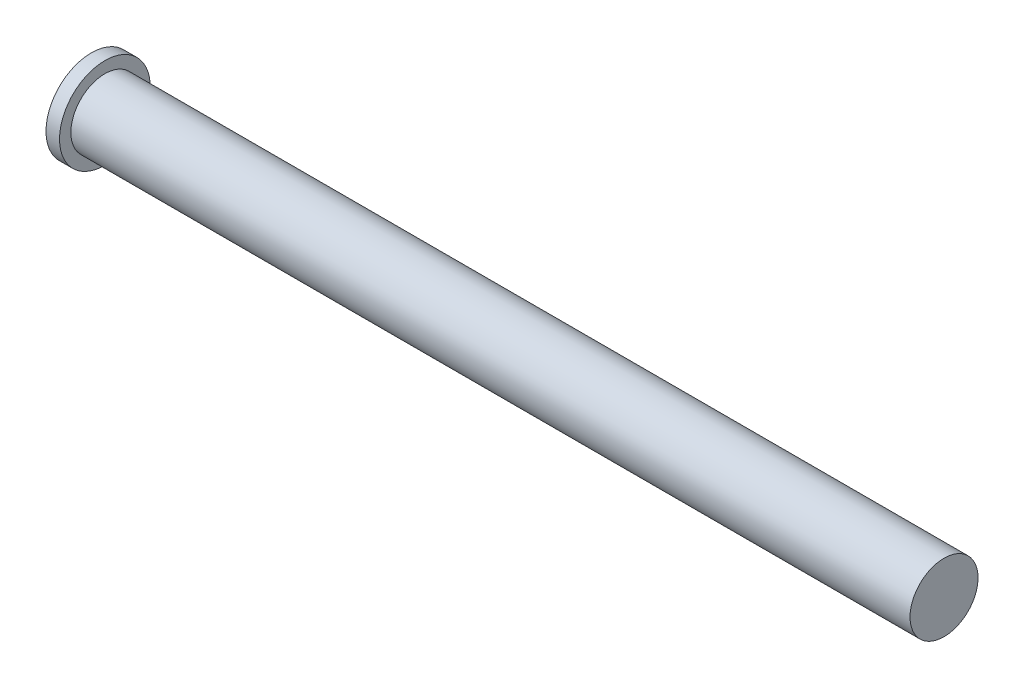
ISO-10303-21;
HEADER;
FILE_DESCRIPTION(('STEP AP214'),'2;1');
FILE_NAME('part.step','',(''),(''),'','','');
FILE_SCHEMA(('AUTOMOTIVE_DESIGN { 1 0 10303 214 1 1 1 1 }'));
ENDSEC;
DATA;
#1=APPLICATION_CONTEXT('core data for automotive mechanical design processes');
#2=APPLICATION_PROTOCOL_DEFINITION('international standard','automotive_design',2000,#1);
#3=PRODUCT_CONTEXT('',#1,'mechanical');
#4=PRODUCT('Part','Part','',(#3));
#5=PRODUCT_RELATED_PRODUCT_CATEGORY('part','',(#4));
#6=PRODUCT_DEFINITION_FORMATION('','',#4);
#7=PRODUCT_DEFINITION_CONTEXT('part definition',#1,'design');
#8=PRODUCT_DEFINITION('design','',#6,#7);
#9=PRODUCT_DEFINITION_SHAPE('','',#8);
#10=(LENGTH_UNIT() NAMED_UNIT(*) SI_UNIT(.MILLI.,.METRE.));
#11=(NAMED_UNIT(*) PLANE_ANGLE_UNIT() SI_UNIT($,.RADIAN.));
#12=(NAMED_UNIT(*) SI_UNIT($,.STERADIAN.) SOLID_ANGLE_UNIT());
#13=UNCERTAINTY_MEASURE_WITH_UNIT(LENGTH_MEASURE(1.E-05),#10,'distance_accuracy_value','');
#14=(GEOMETRIC_REPRESENTATION_CONTEXT(3) GLOBAL_UNCERTAINTY_ASSIGNED_CONTEXT((#13)) GLOBAL_UNIT_ASSIGNED_CONTEXT((#10,
#11,#12)) REPRESENTATION_CONTEXT('',''));
#15=CARTESIAN_POINT('',(0.,0.,0.));
#16=DIRECTION('',(0.,0.,1.));
#17=DIRECTION('',(1.,0.,0.));
#18=AXIS2_PLACEMENT_3D('',#15,#16,#17);
#19=CARTESIAN_POINT('',(1.5,0.,0.866025403784439));
#20=DIRECTION('',(-1.,0.,0.));
#21=DIRECTION('',(0.,0.,1.));
#22=AXIS2_PLACEMENT_3D('',#19,#20,#21);
#23=PLANE('',#22);
#24=DIRECTION('',(0.,0.,1.));
#25=VECTOR('',#24,1.);
#26=CARTESIAN_POINT('',(1.5,-0.75,-0.433012701892219));
#27=LINE('',#26,#25);
#28=CARTESIAN_POINT('',(1.5,-0.75,0.43301270189222));
#29=VERTEX_POINT('',#28);
#30=CARTESIAN_POINT('',(1.5,-0.75,-0.433012701892219));
#31=VERTEX_POINT('',#30);
#32=EDGE_CURVE('E130',#29,#31,#27,.F.);
#33=ORIENTED_EDGE('',*,*,#32,.F.);
#34=DIRECTION('',(0.,0.866025403784439,0.5));
#35=VECTOR('',#34,1.);
#36=CARTESIAN_POINT('',(1.5,-0.75,0.43301270189222));
#37=LINE('',#36,#35);
#38=CARTESIAN_POINT('',(1.5,0.,0.866025403784439));
#39=VERTEX_POINT('',#38);
#40=EDGE_CURVE('E124',#39,#29,#37,.F.);
#41=ORIENTED_EDGE('',*,*,#40,.F.);
#42=DIRECTION('',(0.,0.866025403784439,-0.5));
#43=VECTOR('',#42,1.);
#44=CARTESIAN_POINT('',(1.5,0.75,0.433012701892219));
#45=LINE('',#44,#43);
#46=CARTESIAN_POINT('',(1.5,0.75,0.433012701892219));
#47=VERTEX_POINT('',#46);
#48=EDGE_CURVE('E74',#47,#39,#45,.F.);
#49=ORIENTED_EDGE('',*,*,#48,.F.);
#50=DIRECTION('',(0.,0.,-1.));
#51=VECTOR('',#50,1.);
#52=CARTESIAN_POINT('',(1.5,0.75,0.433012701892219));
#53=LINE('',#52,#51);
#54=CARTESIAN_POINT('',(1.5,0.75,-0.43301270189222));
#55=VERTEX_POINT('',#54);
#56=EDGE_CURVE('E71',#55,#47,#53,.F.);
#57=ORIENTED_EDGE('',*,*,#56,.F.);
#58=DIRECTION('',(0.,-0.866025403784439,-0.5));
#59=VECTOR('',#58,1.);
#60=CARTESIAN_POINT('',(1.5,0.75,-0.43301270189222));
#61=LINE('',#60,#59);
#62=CARTESIAN_POINT('',(1.5,0.,-0.866025403784439));
#63=VERTEX_POINT('',#62);
#64=EDGE_CURVE('E68',#63,#55,#61,.F.);
#65=ORIENTED_EDGE('',*,*,#64,.F.);
#66=DIRECTION('',(0.,-0.866025403784439,0.5));
#67=VECTOR('',#66,1.);
#68=CARTESIAN_POINT('',(1.5,0.,-0.866025403784439));
#69=LINE('',#68,#67);
#70=EDGE_CURVE('E85',#31,#63,#69,.F.);
#71=ORIENTED_EDGE('',*,*,#70,.F.);
#72=EDGE_LOOP('',(#33,#41,#49,#57,#65,#71));
#73=FACE_BOUND('',#72,.T.);
#74=ADVANCED_FACE('F17',(#73),#23,.T.);
#75=CARTESIAN_POINT('',(1.5,0.75,0.433012701892219));
#76=DIRECTION('',(0.,-1.,0.));
#77=DIRECTION('',(0.,0.,-1.));
#78=AXIS2_PLACEMENT_3D('',#75,#76,#77);
#79=PLANE('',#78);
#80=ORIENTED_EDGE('',*,*,#56,.T.);
#81=DIRECTION('',(1.,0.,0.));
#82=VECTOR('',#81,1.);
#83=CARTESIAN_POINT('',(1.5,0.75,0.433012701892219));
#84=LINE('',#83,#82);
#85=CARTESIAN_POINT('',(0.,0.75,0.433012701892219));
#86=VERTEX_POINT('',#85);
#87=EDGE_CURVE('E120',#86,#47,#84,.T.);
#88=ORIENTED_EDGE('',*,*,#87,.F.);
#89=DIRECTION('',(0.,0.,-1.));
#90=VECTOR('',#89,1.);
#91=CARTESIAN_POINT('',(0.,0.75,0.));
#92=LINE('',#91,#90);
#93=CARTESIAN_POINT('',(0.,0.75,-0.43301270189222));
#94=VERTEX_POINT('',#93);
#95=EDGE_CURVE('E82',#86,#94,#92,.T.);
#96=ORIENTED_EDGE('',*,*,#95,.T.);
#97=DIRECTION('',(1.,0.,0.));
#98=VECTOR('',#97,1.);
#99=CARTESIAN_POINT('',(1.5,0.75,-0.43301270189222));
#100=LINE('',#99,#98);
#101=EDGE_CURVE('E79',#55,#94,#100,.F.);
#102=ORIENTED_EDGE('',*,*,#101,.F.);
#103=EDGE_LOOP('',(#80,#88,#96,#102));
#104=FACE_BOUND('',#103,.T.);
#105=ADVANCED_FACE('F80',(#104),#79,.T.);
#106=CARTESIAN_POINT('',(1.5,0.75,-0.43301270189222));
#107=DIRECTION('',(0.,-0.5,0.866025403784439));
#108=DIRECTION('',(0.,-0.866025403784439,-0.5));
#109=AXIS2_PLACEMENT_3D('',#106,#107,#108);
#110=PLANE('',#109);
#111=ORIENTED_EDGE('',*,*,#64,.T.);
#112=ORIENTED_EDGE('',*,*,#101,.T.);
#113=DIRECTION('',(0.,-0.866025403784439,-0.5));
#114=VECTOR('',#113,1.);
#115=CARTESIAN_POINT('',(0.,0.75,-0.43301270189222));
#116=LINE('',#115,#114);
#117=CARTESIAN_POINT('',(0.,0.,-0.866025403784439));
#118=VERTEX_POINT('',#117);
#119=EDGE_CURVE('E114',#94,#118,#116,.T.);
#120=ORIENTED_EDGE('',*,*,#119,.T.);
#121=DIRECTION('',(1.,0.,0.));
#122=VECTOR('',#121,1.);
#123=CARTESIAN_POINT('',(1.5,0.,-0.866025403784439));
#124=LINE('',#123,#122);
#125=EDGE_CURVE('E89',#63,#118,#124,.F.);
#126=ORIENTED_EDGE('',*,*,#125,.F.);
#127=EDGE_LOOP('',(#111,#112,#120,#126));
#128=FACE_BOUND('',#127,.T.);
#129=ADVANCED_FACE('F87',(#128),#110,.T.);
#130=CARTESIAN_POINT('',(1.5,0.,-0.866025403784439));
#131=DIRECTION('',(0.,0.5,0.866025403784439));
#132=DIRECTION('',(0.,-0.866025403784439,0.5));
#133=AXIS2_PLACEMENT_3D('',#130,#131,#132);
#134=PLANE('',#133);
#135=ORIENTED_EDGE('',*,*,#70,.T.);
#136=ORIENTED_EDGE('',*,*,#125,.T.);
#137=DIRECTION('',(0.,-0.866025403784439,0.5));
#138=VECTOR('',#137,1.);
#139=CARTESIAN_POINT('',(0.,0.,-0.866025403784439));
#140=LINE('',#139,#138);
#141=CARTESIAN_POINT('',(0.,-0.75,-0.433012701892219));
#142=VERTEX_POINT('',#141);
#143=EDGE_CURVE('E112',#118,#142,#140,.T.);
#144=ORIENTED_EDGE('',*,*,#143,.T.);
#145=DIRECTION('',(1.,0.,0.));
#146=VECTOR('',#145,1.);
#147=CARTESIAN_POINT('',(1.5,-0.75,-0.433012701892219));
#148=LINE('',#147,#146);
#149=EDGE_CURVE('E127',#31,#142,#148,.F.);
#150=ORIENTED_EDGE('',*,*,#149,.F.);
#151=EDGE_LOOP('',(#135,#136,#144,#150));
#152=FACE_BOUND('',#151,.T.);
#153=ADVANCED_FACE('F135',(#152),#134,.T.);
#154=CARTESIAN_POINT('',(1.5,-0.75,-0.433012701892219));
#155=DIRECTION('',(0.,1.,0.));
#156=DIRECTION('',(0.,0.,1.));
#157=AXIS2_PLACEMENT_3D('',#154,#155,#156);
#158=PLANE('',#157);
#159=ORIENTED_EDGE('',*,*,#32,.T.);
#160=ORIENTED_EDGE('',*,*,#149,.T.);
#161=DIRECTION('',(0.,0.,-1.));
#162=VECTOR('',#161,1.);
#163=CARTESIAN_POINT('',(0.,-0.75,0.));
#164=LINE('',#163,#162);
#165=CARTESIAN_POINT('',(0.,-0.75,0.43301270189222));
#166=VERTEX_POINT('',#165);
#167=EDGE_CURVE('E110',#142,#166,#164,.F.);
#168=ORIENTED_EDGE('',*,*,#167,.T.);
#169=DIRECTION('',(1.,0.,0.));
#170=VECTOR('',#169,1.);
#171=CARTESIAN_POINT('',(1.5,-0.75,0.43301270189222));
#172=LINE('',#171,#170);
#173=EDGE_CURVE('E122',#29,#166,#172,.F.);
#174=ORIENTED_EDGE('',*,*,#173,.F.);
#175=EDGE_LOOP('',(#159,#160,#168,#174));
#176=FACE_BOUND('',#175,.T.);
#177=ADVANCED_FACE('F139',(#176),#158,.T.);
#178=CARTESIAN_POINT('',(1.5,-0.75,0.43301270189222));
#179=DIRECTION('',(0.,0.5,-0.866025403784439));
#180=DIRECTION('',(0.,0.866025403784439,0.5));
#181=AXIS2_PLACEMENT_3D('',#178,#179,#180);
#182=PLANE('',#181);
#183=ORIENTED_EDGE('',*,*,#40,.T.);
#184=ORIENTED_EDGE('',*,*,#173,.T.);
#185=DIRECTION('',(0.,0.866025403784439,0.5));
#186=VECTOR('',#185,1.);
#187=CARTESIAN_POINT('',(0.,-0.75,0.43301270189222));
#188=LINE('',#187,#186);
#189=CARTESIAN_POINT('',(0.,0.,0.866025403784439));
#190=VERTEX_POINT('',#189);
#191=EDGE_CURVE('E35',#166,#190,#188,.T.);
#192=ORIENTED_EDGE('',*,*,#191,.T.);
#193=DIRECTION('',(1.,0.,0.));
#194=VECTOR('',#193,1.);
#195=CARTESIAN_POINT('',(1.5,0.,0.866025403784439));
#196=LINE('',#195,#194);
#197=EDGE_CURVE('E117',#39,#190,#196,.F.);
#198=ORIENTED_EDGE('',*,*,#197,.F.);
#199=EDGE_LOOP('',(#183,#184,#192,#198));
#200=FACE_BOUND('',#199,.T.);
#201=ADVANCED_FACE('F141',(#200),#182,.T.);
#202=CARTESIAN_POINT('',(1.5,0.75,0.433012701892219));
#203=DIRECTION('',(0.,-0.5,-0.866025403784439));
#204=DIRECTION('',(0.,0.866025403784439,-0.5));
#205=AXIS2_PLACEMENT_3D('',#202,#203,#204);
#206=PLANE('',#205);
#207=ORIENTED_EDGE('',*,*,#48,.T.);
#208=ORIENTED_EDGE('',*,*,#197,.T.);
#209=DIRECTION('',(0.,0.866025403784439,-0.5));
#210=VECTOR('',#209,1.);
#211=CARTESIAN_POINT('',(0.,0.,0.866025403784439));
#212=LINE('',#211,#210);
#213=EDGE_CURVE('E105',#190,#86,#212,.T.);
#214=ORIENTED_EDGE('',*,*,#213,.T.);
#215=ORIENTED_EDGE('',*,*,#87,.T.);
#216=EDGE_LOOP('',(#207,#208,#214,#215));
#217=FACE_BOUND('',#216,.T.);
#218=ADVANCED_FACE('F144',(#217),#206,.T.);
#219=CARTESIAN_POINT('',(0.,0.,0.));
#220=DIRECTION('',(1.,0.,0.));
#221=DIRECTION('',(0.,0.,-1.));
#222=AXIS2_PLACEMENT_3D('',#219,#220,#221);
#223=PLANE('',#222);
#224=ORIENTED_EDGE('',*,*,#191,.F.);
#225=ORIENTED_EDGE('',*,*,#167,.F.);
#226=ORIENTED_EDGE('',*,*,#143,.F.);
#227=ORIENTED_EDGE('',*,*,#119,.F.);
#228=ORIENTED_EDGE('',*,*,#95,.F.);
#229=ORIENTED_EDGE('',*,*,#213,.F.);
#230=EDGE_LOOP('',(#224,#225,#226,#227,#228,#229));
#231=FACE_BOUND('',#230,.T.);
#232=CARTESIAN_POINT('',(-1.52310347494022E-11,0.,0.));
#233=DIRECTION('',(1.,0.,0.));
#234=DIRECTION('',(0.,1.,0.));
#235=AXIS2_PLACEMENT_3D('',#232,#233,#234);
#236=CIRCLE('',#235,1.30000000001473);
#237=CARTESIAN_POINT('',(-1.52310523676875E-11,1.30000000001473,0.));
#238=VERTEX_POINT('',#237);
#239=EDGE_CURVE('E20',#238,#238,#236,.T.);
#240=ORIENTED_EDGE('',*,*,#239,.F.);
#241=EDGE_LOOP('',(#240));
#242=FACE_BOUND('',#241,.T.);
#243=ADVANCED_FACE('F146',(#231,#242),#223,.F.);
#244=CARTESIAN_POINT('',(0.404145188326765,0.,0.));
#245=DIRECTION('',(1.,0.,0.));
#246=DIRECTION('',(0.,1.,0.));
#247=AXIS2_PLACEMENT_3D('',#244,#245,#246);
#248=CONICAL_SURFACE('',#247,1.99999999983902,1.04719755118513);
#249=CARTESIAN_POINT('',(0.404145188432737,0.,0.));
#250=DIRECTION('',(-1.,0.,0.));
#251=DIRECTION('',(0.,0.,1.));
#252=AXIS2_PLACEMENT_3D('',#249,#250,#251);
#253=CIRCLE('',#252,2.);
#254=CARTESIAN_POINT('',(0.404145188432737,0.,2.));
#255=VERTEX_POINT('',#254);
#256=EDGE_CURVE('E97',#255,#255,#253,.F.);
#257=ORIENTED_EDGE('',*,*,#256,.F.);
#258=EDGE_LOOP('',(#257));
#259=FACE_BOUND('',#258,.T.);
#260=ORIENTED_EDGE('',*,*,#239,.T.);
#261=EDGE_LOOP('',(#260));
#262=FACE_BOUND('',#261,.T.);
#263=ADVANCED_FACE('F149',(#259,#262),#248,.T.);
#264=CARTESIAN_POINT('',(0.,0.,0.));
#265=DIRECTION('',(-1.,0.,0.));
#266=DIRECTION('',(0.,0.,1.));
#267=AXIS2_PLACEMENT_3D('',#264,#265,#266);
#268=CYLINDRICAL_SURFACE('',#267,2.);
#269=ORIENTED_EDGE('',*,*,#256,.T.);
#270=EDGE_LOOP('',(#269));
#271=FACE_BOUND('',#270,.T.);
#272=CARTESIAN_POINT('',(1.,0.,0.));
#273=DIRECTION('',(-1.,0.,0.));
#274=DIRECTION('',(0.,0.,1.));
#275=AXIS2_PLACEMENT_3D('',#272,#273,#274);
#276=CIRCLE('',#275,2.);
#277=CARTESIAN_POINT('',(1.,0.,2.));
#278=VERTEX_POINT('',#277);
#279=EDGE_CURVE('E95',#278,#278,#276,.T.);
#280=ORIENTED_EDGE('',*,*,#279,.T.);
#281=EDGE_LOOP('',(#280));
#282=FACE_BOUND('',#281,.T.);
#283=ADVANCED_FACE('F154',(#271,#282),#268,.T.);
#284=CARTESIAN_POINT('',(38.,0.,-1.5));
#285=DIRECTION('',(-1.,0.,0.));
#286=DIRECTION('',(0.,0.,1.));
#287=AXIS2_PLACEMENT_3D('',#284,#285,#286);
#288=PLANE('',#287);
#289=CARTESIAN_POINT('',(38.,0.,0.));
#290=DIRECTION('',(-1.,0.,0.));
#291=DIRECTION('',(0.,0.,1.));
#292=AXIS2_PLACEMENT_3D('',#289,#290,#291);
#293=CIRCLE('',#292,1.5);
#294=CARTESIAN_POINT('',(38.,0.,1.5));
#295=VERTEX_POINT('',#294);
#296=EDGE_CURVE('E26',#295,#295,#293,.T.);
#297=ORIENTED_EDGE('',*,*,#296,.F.);
#298=EDGE_LOOP('',(#297));
#299=FACE_BOUND('',#298,.T.);
#300=ADVANCED_FACE('F161',(#299),#288,.F.);
#301=CARTESIAN_POINT('',(1.,0.,-2.));
#302=DIRECTION('',(-1.,0.,0.));
#303=DIRECTION('',(0.,0.,1.));
#304=AXIS2_PLACEMENT_3D('',#301,#302,#303);
#305=PLANE('',#304);
#306=CARTESIAN_POINT('',(1.,0.,0.));
#307=DIRECTION('',(-1.,0.,0.));
#308=DIRECTION('',(0.,0.,1.));
#309=AXIS2_PLACEMENT_3D('',#306,#307,#308);
#310=CIRCLE('',#309,1.5);
#311=CARTESIAN_POINT('',(1.,0.,1.5));
#312=VERTEX_POINT('',#311);
#313=EDGE_CURVE('E11',#312,#312,#310,.F.);
#314=ORIENTED_EDGE('',*,*,#313,.F.);
#315=EDGE_LOOP('',(#314));
#316=FACE_BOUND('',#315,.T.);
#317=ORIENTED_EDGE('',*,*,#279,.F.);
#318=EDGE_LOOP('',(#317));
#319=FACE_BOUND('',#318,.T.);
#320=ADVANCED_FACE('F165',(#316,#319),#305,.F.);
#321=CARTESIAN_POINT('',(0.,0.,0.));
#322=DIRECTION('',(-1.,0.,0.));
#323=DIRECTION('',(0.,0.,1.));
#324=AXIS2_PLACEMENT_3D('',#321,#322,#323);
#325=CYLINDRICAL_SURFACE('',#324,1.5);
#326=ORIENTED_EDGE('',*,*,#313,.T.);
#327=EDGE_LOOP('',(#326));
#328=FACE_BOUND('',#327,.T.);
#329=ORIENTED_EDGE('',*,*,#296,.T.);
#330=EDGE_LOOP('',(#329));
#331=FACE_BOUND('',#330,.T.);
#332=ADVANCED_FACE('F163',(#328,#331),#325,.T.);
#333=CLOSED_SHELL('',(#74,#105,#129,#153,#177,#201,#218,#243,#263,#283,#300,#320,#332));
#334=MANIFOLD_SOLID_BREP('B1',#333);
#335=ADVANCED_BREP_SHAPE_REPRESENTATION('',(#18,#334),#14);
#336=SHAPE_DEFINITION_REPRESENTATION(#9,#335);
ENDSEC;
END-ISO-10303-21;
